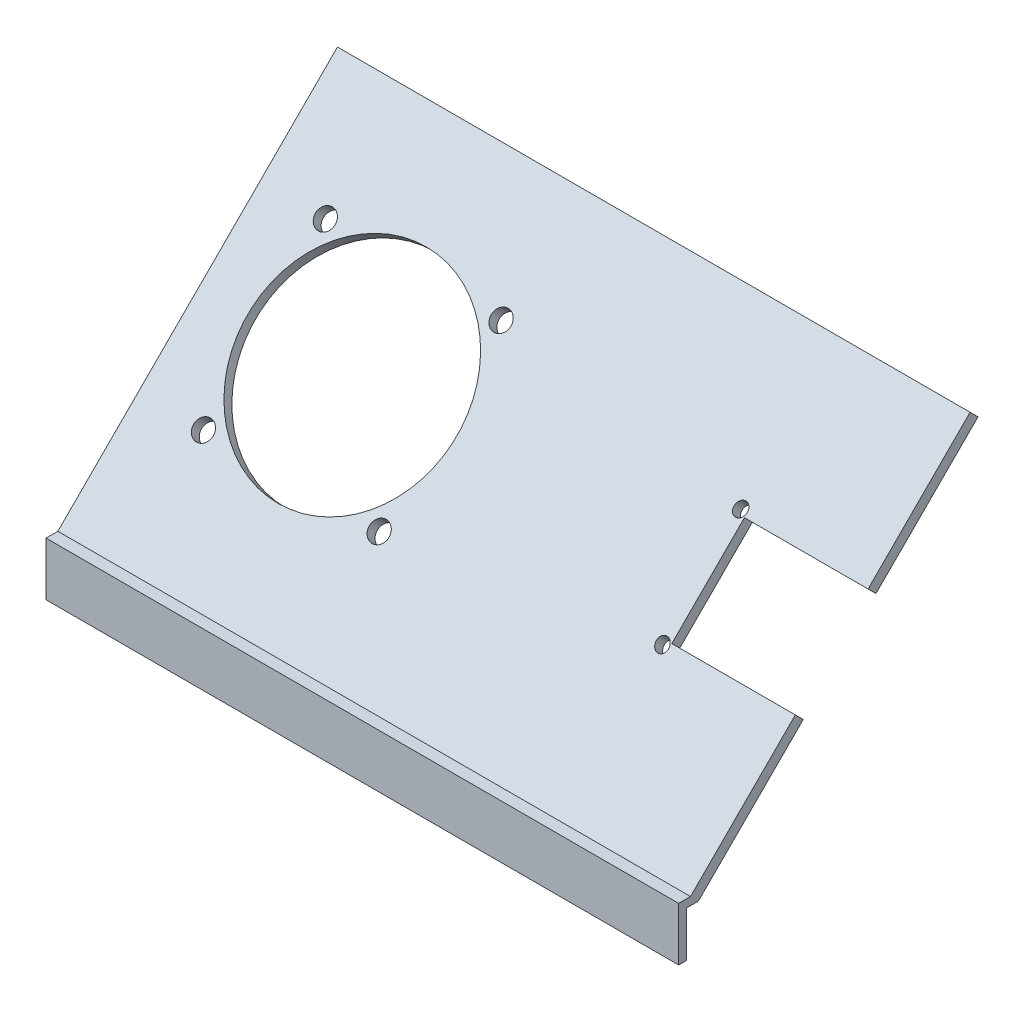
ISO-10303-21;
HEADER;
FILE_DESCRIPTION(('STEP AP214'),'2;1');
FILE_NAME('part.step','',(''),(''),'','','');
FILE_SCHEMA(('AUTOMOTIVE_DESIGN { 1 0 10303 214 1 1 1 1 }'));
ENDSEC;
DATA;
#1=APPLICATION_CONTEXT('core data for automotive mechanical design processes');
#2=APPLICATION_PROTOCOL_DEFINITION('international standard','automotive_design',2000,#1);
#3=PRODUCT_CONTEXT('',#1,'mechanical');
#4=PRODUCT('Part','Part','',(#3));
#5=PRODUCT_RELATED_PRODUCT_CATEGORY('part','',(#4));
#6=PRODUCT_DEFINITION_FORMATION('','',#4);
#7=PRODUCT_DEFINITION_CONTEXT('part definition',#1,'design');
#8=PRODUCT_DEFINITION('design','',#6,#7);
#9=PRODUCT_DEFINITION_SHAPE('','',#8);
#10=(LENGTH_UNIT() NAMED_UNIT(*) SI_UNIT(.MILLI.,.METRE.));
#11=(NAMED_UNIT(*) PLANE_ANGLE_UNIT() SI_UNIT($,.RADIAN.));
#12=(NAMED_UNIT(*) SI_UNIT($,.STERADIAN.) SOLID_ANGLE_UNIT());
#13=UNCERTAINTY_MEASURE_WITH_UNIT(LENGTH_MEASURE(1.E-05),#10,'distance_accuracy_value','');
#14=(GEOMETRIC_REPRESENTATION_CONTEXT(3) GLOBAL_UNCERTAINTY_ASSIGNED_CONTEXT((#13)) GLOBAL_UNIT_ASSIGNED_CONTEXT((#10,
#11,#12)) REPRESENTATION_CONTEXT('',''));
#15=CARTESIAN_POINT('',(0.,0.,0.));
#16=DIRECTION('',(0.,0.,1.));
#17=DIRECTION('',(1.,0.,0.));
#18=AXIS2_PLACEMENT_3D('',#15,#16,#17);
#19=CARTESIAN_POINT('',(160.,0.,0.));
#20=DIRECTION('',(1.,0.,0.));
#21=DIRECTION('',(0.,0.,-1.));
#22=AXIS2_PLACEMENT_3D('',#19,#20,#21);
#23=PLANE('',#22);
#24=DIRECTION('',(0.,-0.707106781186545,-0.70710678118655));
#25=VECTOR('',#24,1.);
#26=CARTESIAN_POINT('',(160.,77.960678118655,-77.9606781186545));
#27=LINE('',#26,#25);
#28=CARTESIAN_POINT('',(160.,84.2106781186548,-71.7106781186547));
#29=VERTEX_POINT('',#28);
#30=CARTESIAN_POINT('',(160.,82.2106781186548,-73.7106781186547));
#31=VERTEX_POINT('',#30);
#32=EDGE_CURVE('E277',#29,#31,#27,.T.);
#33=ORIENTED_EDGE('',*,*,#32,.F.);
#34=DIRECTION('',(0.,0.707106781186548,-0.707106781186548));
#35=VECTOR('',#34,1.);
#36=CARTESIAN_POINT('',(160.,6.25,6.25));
#37=LINE('',#36,#35);
#38=CARTESIAN_POINT('',(160.,58.4012806053458,-45.9012806053458));
#39=VERTEX_POINT('',#38);
#40=EDGE_CURVE('E172',#39,#29,#37,.T.);
#41=ORIENTED_EDGE('',*,*,#40,.F.);
#42=DIRECTION('',(0.,0.707106781186548,0.707106781186547));
#43=VECTOR('',#42,1.);
#44=CARTESIAN_POINT('',(160.,51.3302127934803,-52.9723484172112));
#45=LINE('',#44,#43);
#46=CARTESIAN_POINT('',(160.,56.4012806053458,-47.9012806053457));
#47=VERTEX_POINT('',#46);
#48=EDGE_CURVE('E274',#47,#39,#45,.T.);
#49=ORIENTED_EDGE('',*,*,#48,.F.);
#50=DIRECTION('',(0.,0.707106781186549,-0.707106781186546));
#51=VECTOR('',#50,1.);
#52=CARTESIAN_POINT('',(160.,4.24999999999998,4.25));
#53=LINE('',#52,#51);
#54=EDGE_CURVE('E279',#47,#31,#53,.T.);
#55=ORIENTED_EDGE('',*,*,#54,.T.);
#56=EDGE_LOOP('',(#33,#41,#49,#55));
#57=FACE_BOUND('',#56,.T.);
#58=ADVANCED_FACE('F36',(#57),#23,.T.);
#59=DIRECTION('',(0.,0.,1.));
#60=VECTOR('',#59,1.);
#61=CARTESIAN_POINT('',(160.,13.5,-3.));
#62=LINE('',#61,#60);
#63=CARTESIAN_POINT('',(160.,13.5,-0.999999999999992));
#64=VERTEX_POINT('',#63);
#65=CARTESIAN_POINT('',(160.,13.5,2.));
#66=VERTEX_POINT('',#65);
#67=EDGE_CURVE('E182',#64,#66,#62,.T.);
#68=ORIENTED_EDGE('',*,*,#67,.T.);
#69=DIRECTION('',(0.,-1.,0.));
#70=VECTOR('',#69,1.);
#71=CARTESIAN_POINT('',(160.,13.5,2.));
#72=LINE('',#71,#70);
#73=CARTESIAN_POINT('',(160.,0.,2.));
#74=VERTEX_POINT('',#73);
#75=EDGE_CURVE('E179',#66,#74,#72,.T.);
#76=ORIENTED_EDGE('',*,*,#75,.T.);
#77=DIRECTION('',(0.,0.,-1.));
#78=VECTOR('',#77,1.);
#79=CARTESIAN_POINT('',(160.,0.,0.));
#80=LINE('',#79,#78);
#81=CARTESIAN_POINT('',(160.,0.,0.));
#82=VERTEX_POINT('',#81);
#83=EDGE_CURVE('E282',#74,#82,#80,.T.);
#84=ORIENTED_EDGE('',*,*,#83,.T.);
#85=DIRECTION('',(0.,1.,0.));
#86=VECTOR('',#85,1.);
#87=CARTESIAN_POINT('',(160.,0.,0.));
#88=LINE('',#87,#86);
#89=CARTESIAN_POINT('',(160.,11.5,0.));
#90=VERTEX_POINT('',#89);
#91=EDGE_CURVE('E285',#82,#90,#88,.T.);
#92=ORIENTED_EDGE('',*,*,#91,.T.);
#93=DIRECTION('',(0.,0.,-1.));
#94=VECTOR('',#93,1.);
#95=CARTESIAN_POINT('',(160.,11.5,0.));
#96=LINE('',#95,#94);
#97=CARTESIAN_POINT('',(160.,11.5,-3.));
#98=VERTEX_POINT('',#97);
#99=EDGE_CURVE('E288',#90,#98,#96,.T.);
#100=ORIENTED_EDGE('',*,*,#99,.T.);
#101=CARTESIAN_POINT('',(160.,38.0165042944956,-29.5165042944955));
#102=VERTEX_POINT('',#101);
#103=EDGE_CURVE('E173',#98,#102,#53,.T.);
#104=ORIENTED_EDGE('',*,*,#103,.T.);
#105=DIRECTION('',(0.,0.707106781186548,0.707106781186547));
#106=VECTOR('',#105,1.);
#107=CARTESIAN_POINT('',(160.,32.9454364826301,-34.587572106361));
#108=LINE('',#107,#106);
#109=CARTESIAN_POINT('',(160.,40.0165042944955,-27.5165042944955));
#110=VERTEX_POINT('',#109);
#111=EDGE_CURVE('E157',#102,#110,#108,.T.);
#112=ORIENTED_EDGE('',*,*,#111,.T.);
#113=EDGE_CURVE('E165',#64,#110,#37,.T.);
#114=ORIENTED_EDGE('',*,*,#113,.F.);
#115=EDGE_LOOP('',(#68,#76,#84,#92,#100,#104,#112,#114));
#116=FACE_BOUND('',#115,.T.);
#117=ADVANCED_FACE('F176',(#116),#23,.T.);
#118=CARTESIAN_POINT('',(160.,6.25,6.25));
#119=DIRECTION('',(0.,0.707106781186548,0.707106781186548));
#120=DIRECTION('',(0.,-0.707106781186548,0.707106781186548));
#121=AXIS2_PLACEMENT_3D('',#118,#119,#120);
#122=PLANE('',#121);
#123=CARTESIAN_POINT('',(60.9765015030874,64.623057492428,-52.123057492428));
#124=DIRECTION('',(0.,0.707106781186548,0.707106781186547));
#125=DIRECTION('',(0.,-0.707106781186547,0.707106781186548));
#126=AXIS2_PLACEMENT_3D('',#123,#124,#125);
#127=CIRCLE('',#126,2.5);
#128=CARTESIAN_POINT('',(60.9765015030874,62.8552905394617,-50.3552905394617));
#129=VERTEX_POINT('',#128);
#130=EDGE_CURVE('E11',#129,#129,#127,.F.);
#131=ORIENTED_EDGE('',*,*,#130,.T.);
#132=EDGE_LOOP('',(#131));
#133=FACE_BOUND('',#132,.T.);
#134=CARTESIAN_POINT('',(60.9765015030874,33.7947274074133,-21.2947274074133));
#135=DIRECTION('',(0.,0.707106781186548,0.707106781186547));
#136=DIRECTION('',(0.,-0.707106781186547,0.707106781186548));
#137=AXIS2_PLACEMENT_3D('',#134,#135,#136);
#138=CIRCLE('',#137,2.5);
#139=CARTESIAN_POINT('',(60.9765015030874,32.0269604544469,-19.5269604544469));
#140=VERTEX_POINT('',#139);
#141=EDGE_CURVE('E45',#140,#140,#138,.T.);
#142=ORIENTED_EDGE('',*,*,#141,.F.);
#143=EDGE_LOOP('',(#142));
#144=FACE_BOUND('',#143,.T.);
#145=CARTESIAN_POINT('',(127.193555514503,59.2643272931947,-46.7643272931947));
#146=DIRECTION('',(0.,0.707106781186548,0.707106781186547));
#147=DIRECTION('',(0.,-0.707106781186547,0.707106781186548));
#148=AXIS2_PLACEMENT_3D('',#145,#146,#147);
#149=CIRCLE('',#148,1.49999991751132);
#150=CARTESIAN_POINT('',(127.751653592072,60.2488389204361,-47.7488389204361));
#151=VERTEX_POINT('',#150);
#152=CARTESIAN_POINT('',(127.174287998158,60.3248999015878,-47.8248999015878));
#153=VERTEX_POINT('',#152);
#154=EDGE_CURVE('E258',#151,#153,#149,.T.);
#155=ORIENTED_EDGE('',*,*,#154,.F.);
#156=CARTESIAN_POINT('',(127.09453464431,59.1042505586769,-46.604250558677));
#157=DIRECTION('',(0.,0.707106781186548,0.707106781186547));
#158=DIRECTION('',(0.376143738412848,0.655177795736702,-0.655177795736702));
#159=AXIS2_PLACEMENT_3D('',#156,#157,#158);
#160=ELLIPSE('',#159,1.74698893735955,1.59594606809434);
#161=CARTESIAN_POINT('',(127.274685923613,57.9020454944957,-45.4020454944957));
#162=VERTEX_POINT('',#161);
#163=EDGE_CURVE('E530',#162,#151,#160,.T.);
#164=ORIENTED_EDGE('',*,*,#163,.F.);
#165=CARTESIAN_POINT('',(126.995513774118,58.9441738241592,-46.4441738241592));
#166=DIRECTION('',(0.,0.707106781186548,0.707106781186547));
#167=DIRECTION('',(0.,-0.707106781186547,0.707106781186548));
#168=AXIS2_PLACEMENT_3D('',#165,#166,#167);
#169=CIRCLE('',#168,1.50000000000946);
#170=CARTESIAN_POINT('',(126.437433079218,57.9596572072328,-45.4596572072328));
#171=VERTEX_POINT('',#170);
#172=EDGE_CURVE('E531',#171,#162,#169,.T.);
#173=ORIENTED_EDGE('',*,*,#172,.F.);
#174=EDGE_CURVE('E532',#153,#171,#160,.T.);
#175=ORIENTED_EDGE('',*,*,#174,.F.);
#176=EDGE_LOOP('',(#155,#164,#173,#175));
#177=FACE_BOUND('',#176,.T.);
#178=CARTESIAN_POINT('',(127.09453464431,39.3135343411643,-26.8135343411643));
#179=DIRECTION('',(0.,-0.707106781186548,-0.707106781186547));
#180=DIRECTION('',(0.376143738412848,-0.655177795736702,0.655177795736702));
#181=AXIS2_PLACEMENT_3D('',#178,#179,#180);
#182=ELLIPSE('',#181,1.74698893735955,1.59594606809433);
#183=CARTESIAN_POINT('',(127.751653594175,38.1689459800087,-25.6689459800087));
#184=VERTEX_POINT('',#183);
#185=EDGE_CURVE('E231',#184,#184,#182,.T.);
#186=ORIENTED_EDGE('',*,*,#185,.T.);
#187=EDGE_LOOP('',(#186));
#188=FACE_BOUND('',#187,.T.);
#189=CARTESIAN_POINT('',(38.75,49.2088924499207,-36.7088924499206));
#190=DIRECTION('',(0.,0.707106781186548,0.707106781186547));
#191=DIRECTION('',(0.,-0.707106781186547,0.707106781186548));
#192=AXIS2_PLACEMENT_3D('',#189,#190,#191);
#193=CIRCLE('',#192,26.5);
#194=CARTESIAN_POINT('',(38.75,30.4705627484772,-17.9705627484771));
#195=VERTEX_POINT('',#194);
#196=EDGE_CURVE('E260',#195,#195,#193,.T.);
#197=ORIENTED_EDGE('',*,*,#196,.F.);
#198=EDGE_LOOP('',(#197));
#199=FACE_BOUND('',#198,.T.);
#200=CARTESIAN_POINT('',(16.5234984969126,64.623057492428,-52.123057492428));
#201=DIRECTION('',(0.,0.707106781186548,0.707106781186547));
#202=DIRECTION('',(0.,-0.707106781186547,0.707106781186548));
#203=AXIS2_PLACEMENT_3D('',#200,#201,#202);
#204=CIRCLE('',#203,2.5);
#205=CARTESIAN_POINT('',(16.5234984969126,62.8552905394617,-50.3552905394617));
#206=VERTEX_POINT('',#205);
#207=EDGE_CURVE('E265',#206,#206,#204,.T.);
#208=ORIENTED_EDGE('',*,*,#207,.F.);
#209=EDGE_LOOP('',(#208));
#210=FACE_BOUND('',#209,.T.);
#211=CARTESIAN_POINT('',(16.5234984969126,33.7947274074133,-21.2947274074133));
#212=DIRECTION('',(0.,0.707106781186548,0.707106781186547));
#213=DIRECTION('',(0.,-0.707106781186547,0.707106781186548));
#214=AXIS2_PLACEMENT_3D('',#211,#212,#213);
#215=CIRCLE('',#214,2.5);
#216=CARTESIAN_POINT('',(16.5234984969126,32.0269604544469,-19.5269604544469));
#217=VERTEX_POINT('',#216);
#218=EDGE_CURVE('E267',#217,#217,#215,.F.);
#219=ORIENTED_EDGE('',*,*,#218,.T.);
#220=EDGE_LOOP('',(#219));
#221=FACE_BOUND('',#220,.T.);
#222=DIRECTION('',(-1.,0.,0.));
#223=VECTOR('',#222,1.);
#224=CARTESIAN_POINT('',(160.,13.5,-0.999999999999992));
#225=LINE('',#224,#223);
#226=CARTESIAN_POINT('',(0.,13.5,-0.999999999999992));
#227=VERTEX_POINT('',#226);
#228=EDGE_CURVE('E168',#64,#227,#225,.T.);
#229=ORIENTED_EDGE('',*,*,#228,.F.);
#230=ORIENTED_EDGE('',*,*,#113,.T.);
#231=DIRECTION('',(1.,0.,0.));
#232=VECTOR('',#231,1.);
#233=CARTESIAN_POINT('',(0.,40.0165042944955,-27.5165042944955));
#234=LINE('',#233,#232);
#235=CARTESIAN_POINT('',(128.75,40.0165042944955,-27.5165042944955));
#236=VERTEX_POINT('',#235);
#237=EDGE_CURVE('E152',#236,#110,#234,.T.);
#238=ORIENTED_EDGE('',*,*,#237,.F.);
#239=DIRECTION('',(0.,0.707106781186547,-0.707106781186548));
#240=VECTOR('',#239,1.);
#241=CARTESIAN_POINT('',(128.75,6.25000000000001,6.25000000000001));
#242=LINE('',#241,#240);
#243=CARTESIAN_POINT('',(128.75,58.4012806053458,-45.9012806053457));
#244=VERTEX_POINT('',#243);
#245=EDGE_CURVE('E162',#236,#244,#242,.T.);
#246=ORIENTED_EDGE('',*,*,#245,.T.);
#247=DIRECTION('',(1.,0.,0.));
#248=VECTOR('',#247,1.);
#249=CARTESIAN_POINT('',(0.,58.4012806053458,-45.9012806053458));
#250=LINE('',#249,#248);
#251=EDGE_CURVE('E40',#244,#39,#250,.T.);
#252=ORIENTED_EDGE('',*,*,#251,.T.);
#253=ORIENTED_EDGE('',*,*,#40,.T.);
#254=DIRECTION('',(-1.,0.,0.));
#255=VECTOR('',#254,1.);
#256=CARTESIAN_POINT('',(160.,84.2106781186548,-71.7106781186547));
#257=LINE('',#256,#255);
#258=CARTESIAN_POINT('',(0.,84.2106781186548,-71.7106781186547));
#259=VERTEX_POINT('',#258);
#260=EDGE_CURVE('E204',#29,#259,#257,.T.);
#261=ORIENTED_EDGE('',*,*,#260,.T.);
#262=DIRECTION('',(0.,0.707106781186548,-0.707106781186548));
#263=VECTOR('',#262,1.);
#264=CARTESIAN_POINT('',(0.,6.25,6.25));
#265=LINE('',#264,#263);
#266=EDGE_CURVE('E214',#227,#259,#265,.T.);
#267=ORIENTED_EDGE('',*,*,#266,.F.);
#268=EDGE_LOOP('',(#229,#230,#238,#246,#252,#253,#261,#267));
#269=FACE_BOUND('',#268,.T.);
#270=ADVANCED_FACE('F166',(#133,#144,#177,#188,#199,#210,#221,#269),#122,.T.);
#271=CARTESIAN_POINT('',(160.,4.24999999999998,4.25));
#272=DIRECTION('',(0.,0.707106781186546,0.707106781186549));
#273=DIRECTION('',(0.,-0.707106781186549,0.707106781186546));
#274=AXIS2_PLACEMENT_3D('',#271,#272,#273);
#275=PLANE('',#274);
#276=CARTESIAN_POINT('',(60.9765015030874,62.6230574924281,-54.1230574924279));
#277=DIRECTION('',(0.,0.707106781186546,0.707106781186549));
#278=DIRECTION('',(0.,-0.707106781186549,0.707106781186546));
#279=AXIS2_PLACEMENT_3D('',#276,#277,#278);
#280=CIRCLE('',#279,2.5);
#281=CARTESIAN_POINT('',(60.9765015030874,60.8552905394617,-52.3552905394616));
#282=VERTEX_POINT('',#281);
#283=EDGE_CURVE('E263',#282,#282,#280,.F.);
#284=ORIENTED_EDGE('',*,*,#283,.F.);
#285=EDGE_LOOP('',(#284));
#286=FACE_BOUND('',#285,.T.);
#287=CARTESIAN_POINT('',(16.5234984969126,31.7947274074133,-23.2947274074132));
#288=DIRECTION('',(0.,0.707106781186546,0.707106781186549));
#289=DIRECTION('',(0.,-0.707106781186549,0.707106781186546));
#290=AXIS2_PLACEMENT_3D('',#287,#288,#289);
#291=CIRCLE('',#290,2.5);
#292=CARTESIAN_POINT('',(16.5234984969126,30.0269604544469,-21.5269604544469));
#293=VERTEX_POINT('',#292);
#294=EDGE_CURVE('E505',#293,#293,#291,.F.);
#295=ORIENTED_EDGE('',*,*,#294,.F.);
#296=EDGE_LOOP('',(#295));
#297=FACE_BOUND('',#296,.T.);
#298=CARTESIAN_POINT('',(127.09453464431,57.1042505586769,-48.604250558677));
#299=DIRECTION('',(0.,0.707106781186548,0.707106781186547));
#300=DIRECTION('',(0.376143738412848,0.655177795736702,-0.655177795736702));
#301=AXIS2_PLACEMENT_3D('',#298,#299,#300);
#302=ELLIPSE('',#301,1.74698893735955,1.59594606809434);
#303=CARTESIAN_POINT('',(127.274685923613,55.9020454944958,-47.4020454944956));
#304=VERTEX_POINT('',#303);
#305=CARTESIAN_POINT('',(127.751653592072,58.2488389204361,-49.7488389204361));
#306=VERTEX_POINT('',#305);
#307=EDGE_CURVE('E516',#304,#306,#302,.T.);
#308=ORIENTED_EDGE('',*,*,#307,.T.);
#309=CARTESIAN_POINT('',(127.193555514503,57.2643272931948,-48.7643272931946));
#310=DIRECTION('',(0.,0.707106781186546,0.707106781186549));
#311=DIRECTION('',(0.,-0.707106781186549,0.707106781186546));
#312=AXIS2_PLACEMENT_3D('',#309,#310,#311);
#313=CIRCLE('',#312,1.49999991751132);
#314=CARTESIAN_POINT('',(127.174287998158,58.3248999015878,-49.8248999015879));
#315=VERTEX_POINT('',#314);
#316=EDGE_CURVE('E276',#306,#315,#313,.T.);
#317=ORIENTED_EDGE('',*,*,#316,.T.);
#318=CARTESIAN_POINT('',(127.09453464431,57.1042505586769,-48.604250558677));
#319=DIRECTION('',(0.,0.707106781186548,0.707106781186547));
#320=DIRECTION('',(0.376143738412848,0.655177795736702,-0.655177795736702));
#321=AXIS2_PLACEMENT_3D('',#318,#319,#320);
#322=ELLIPSE('',#321,1.74698893735955,1.59594606809434);
#323=CARTESIAN_POINT('',(126.437433079218,55.9596572072327,-47.4596572072328));
#324=VERTEX_POINT('',#323);
#325=EDGE_CURVE('E190',#315,#324,#322,.T.);
#326=ORIENTED_EDGE('',*,*,#325,.T.);
#327=CARTESIAN_POINT('',(126.995513774118,56.9441738241593,-48.4441738241592));
#328=DIRECTION('',(0.,0.707106781186546,0.707106781186549));
#329=DIRECTION('',(0.,-0.707106781186549,0.707106781186546));
#330=AXIS2_PLACEMENT_3D('',#327,#328,#329);
#331=CIRCLE('',#330,1.50000000000946);
#332=EDGE_CURVE('E519',#324,#304,#331,.T.);
#333=ORIENTED_EDGE('',*,*,#332,.T.);
#334=EDGE_LOOP('',(#308,#317,#326,#333));
#335=FACE_BOUND('',#334,.T.);
#336=CARTESIAN_POINT('',(127.09453464431,37.3135343411643,-28.8135343411643));
#337=DIRECTION('',(0.,-0.707106781186548,-0.707106781186547));
#338=DIRECTION('',(0.376143738412848,-0.655177795736702,0.655177795736702));
#339=AXIS2_PLACEMENT_3D('',#336,#337,#338);
#340=ELLIPSE('',#339,1.74698893735955,1.59594606809433);
#341=CARTESIAN_POINT('',(127.751653594175,36.1689459800087,-27.6689459800087));
#342=VERTEX_POINT('',#341);
#343=EDGE_CURVE('E321',#342,#342,#340,.T.);
#344=ORIENTED_EDGE('',*,*,#343,.F.);
#345=EDGE_LOOP('',(#344));
#346=FACE_BOUND('',#345,.T.);
#347=CARTESIAN_POINT('',(38.75,47.2088924499207,-38.7088924499206));
#348=DIRECTION('',(0.,0.707106781186546,0.707106781186549));
#349=DIRECTION('',(0.,-0.707106781186549,0.707106781186546));
#350=AXIS2_PLACEMENT_3D('',#347,#348,#349);
#351=CIRCLE('',#350,26.5);
#352=CARTESIAN_POINT('',(38.75,28.4705627484772,-19.9705627484771));
#353=VERTEX_POINT('',#352);
#354=EDGE_CURVE('E264',#353,#353,#351,.T.);
#355=ORIENTED_EDGE('',*,*,#354,.T.);
#356=EDGE_LOOP('',(#355));
#357=FACE_BOUND('',#356,.T.);
#358=CARTESIAN_POINT('',(16.5234984969126,62.6230574924281,-54.1230574924279));
#359=DIRECTION('',(0.,0.707106781186546,0.707106781186549));
#360=DIRECTION('',(0.,-0.707106781186549,0.707106781186546));
#361=AXIS2_PLACEMENT_3D('',#358,#359,#360);
#362=CIRCLE('',#361,2.5);
#363=CARTESIAN_POINT('',(16.5234984969126,60.8552905394618,-52.3552905394616));
#364=VERTEX_POINT('',#363);
#365=EDGE_CURVE('E268',#364,#364,#362,.T.);
#366=ORIENTED_EDGE('',*,*,#365,.T.);
#367=EDGE_LOOP('',(#366));
#368=FACE_BOUND('',#367,.T.);
#369=CARTESIAN_POINT('',(60.9765015030874,31.7947274074133,-23.2947274074132));
#370=DIRECTION('',(0.,0.707106781186546,0.707106781186549));
#371=DIRECTION('',(0.,-0.707106781186549,0.707106781186546));
#372=AXIS2_PLACEMENT_3D('',#369,#370,#371);
#373=CIRCLE('',#372,2.5);
#374=CARTESIAN_POINT('',(60.9765015030874,30.0269604544469,-21.5269604544469));
#375=VERTEX_POINT('',#374);
#376=EDGE_CURVE('E502',#375,#375,#373,.T.);
#377=ORIENTED_EDGE('',*,*,#376,.T.);
#378=EDGE_LOOP('',(#377));
#379=FACE_BOUND('',#378,.T.);
#380=ORIENTED_EDGE('',*,*,#103,.F.);
#381=DIRECTION('',(-1.,0.,0.));
#382=VECTOR('',#381,1.);
#383=CARTESIAN_POINT('',(160.,11.5,-3.));
#384=LINE('',#383,#382);
#385=CARTESIAN_POINT('',(0.,11.5,-3.));
#386=VERTEX_POINT('',#385);
#387=EDGE_CURVE('E197',#98,#386,#384,.T.);
#388=ORIENTED_EDGE('',*,*,#387,.T.);
#389=DIRECTION('',(0.,0.707106781186549,-0.707106781186546));
#390=VECTOR('',#389,1.);
#391=CARTESIAN_POINT('',(0.,4.24999999999998,4.25));
#392=LINE('',#391,#390);
#393=CARTESIAN_POINT('',(0.,82.2106781186548,-73.7106781186547));
#394=VERTEX_POINT('',#393);
#395=EDGE_CURVE('E209',#386,#394,#392,.T.);
#396=ORIENTED_EDGE('',*,*,#395,.T.);
#397=DIRECTION('',(-1.,0.,0.));
#398=VECTOR('',#397,1.);
#399=CARTESIAN_POINT('',(160.,82.2106781186548,-73.7106781186547));
#400=LINE('',#399,#398);
#401=EDGE_CURVE('E208',#31,#394,#400,.T.);
#402=ORIENTED_EDGE('',*,*,#401,.F.);
#403=ORIENTED_EDGE('',*,*,#54,.F.);
#404=DIRECTION('',(1.,0.,0.));
#405=VECTOR('',#404,1.);
#406=CARTESIAN_POINT('',(160.,56.4012806053458,-47.9012806053457));
#407=LINE('',#406,#405);
#408=CARTESIAN_POINT('',(128.75,56.4012806053458,-47.9012806053457));
#409=VERTEX_POINT('',#408);
#410=EDGE_CURVE('E186',#409,#47,#407,.T.);
#411=ORIENTED_EDGE('',*,*,#410,.F.);
#412=DIRECTION('',(0.,0.707106781186549,-0.707106781186546));
#413=VECTOR('',#412,1.);
#414=CARTESIAN_POINT('',(128.75,4.24999999999998,4.25));
#415=LINE('',#414,#413);
#416=CARTESIAN_POINT('',(128.75,38.0165042944956,-29.5165042944955));
#417=VERTEX_POINT('',#416);
#418=EDGE_CURVE('E192',#417,#409,#415,.T.);
#419=ORIENTED_EDGE('',*,*,#418,.F.);
#420=DIRECTION('',(1.,0.,0.));
#421=VECTOR('',#420,1.);
#422=CARTESIAN_POINT('',(160.,38.0165042944956,-29.5165042944955));
#423=LINE('',#422,#421);
#424=EDGE_CURVE('E189',#417,#102,#423,.T.);
#425=ORIENTED_EDGE('',*,*,#424,.T.);
#426=EDGE_LOOP('',(#380,#388,#396,#402,#403,#411,#419,#425));
#427=FACE_BOUND('',#426,.T.);
#428=ADVANCED_FACE('F312',(#286,#297,#335,#346,#357,#368,#379,#427),#275,.F.);
#429=CARTESIAN_POINT('',(160.,0.,0.));
#430=DIRECTION('',(0.,1.,0.));
#431=DIRECTION('',(0.,0.,1.));
#432=AXIS2_PLACEMENT_3D('',#429,#430,#431);
#433=PLANE('',#432);
#434=ORIENTED_EDGE('',*,*,#83,.F.);
#435=DIRECTION('',(-1.,0.,0.));
#436=VECTOR('',#435,1.);
#437=CARTESIAN_POINT('',(160.,0.,2.));
#438=LINE('',#437,#436);
#439=CARTESIAN_POINT('',(0.,0.,2.));
#440=VERTEX_POINT('',#439);
#441=EDGE_CURVE('E201',#74,#440,#438,.T.);
#442=ORIENTED_EDGE('',*,*,#441,.T.);
#443=DIRECTION('',(0.,0.,-1.));
#444=VECTOR('',#443,1.);
#445=CARTESIAN_POINT('',(0.,0.,0.));
#446=LINE('',#445,#444);
#447=CARTESIAN_POINT('',(0.,0.,0.));
#448=VERTEX_POINT('',#447);
#449=EDGE_CURVE('E206',#440,#448,#446,.T.);
#450=ORIENTED_EDGE('',*,*,#449,.T.);
#451=DIRECTION('',(-1.,0.,0.));
#452=VECTOR('',#451,1.);
#453=CARTESIAN_POINT('',(160.,0.,0.));
#454=LINE('',#453,#452);
#455=EDGE_CURVE('E193',#82,#448,#454,.T.);
#456=ORIENTED_EDGE('',*,*,#455,.F.);
#457=EDGE_LOOP('',(#434,#442,#450,#456));
#458=FACE_BOUND('',#457,.T.);
#459=ADVANCED_FACE('F300',(#458),#433,.F.);
#460=CARTESIAN_POINT('',(160.,0.,0.));
#461=DIRECTION('',(0.,0.,1.));
#462=DIRECTION('',(1.,0.,0.));
#463=AXIS2_PLACEMENT_3D('',#460,#461,#462);
#464=PLANE('',#463);
#465=ORIENTED_EDGE('',*,*,#91,.F.);
#466=ORIENTED_EDGE('',*,*,#455,.T.);
#467=DIRECTION('',(0.,1.,0.));
#468=VECTOR('',#467,1.);
#469=CARTESIAN_POINT('',(0.,0.,0.));
#470=LINE('',#469,#468);
#471=CARTESIAN_POINT('',(0.,11.5,0.));
#472=VERTEX_POINT('',#471);
#473=EDGE_CURVE('E307',#448,#472,#470,.T.);
#474=ORIENTED_EDGE('',*,*,#473,.T.);
#475=DIRECTION('',(-1.,0.,0.));
#476=VECTOR('',#475,1.);
#477=CARTESIAN_POINT('',(160.,11.5,0.));
#478=LINE('',#477,#476);
#479=EDGE_CURVE('E195',#90,#472,#478,.T.);
#480=ORIENTED_EDGE('',*,*,#479,.F.);
#481=EDGE_LOOP('',(#465,#466,#474,#480));
#482=FACE_BOUND('',#481,.T.);
#483=ADVANCED_FACE('F304',(#482),#464,.F.);
#484=CARTESIAN_POINT('',(160.,11.5,0.));
#485=DIRECTION('',(0.,1.,0.));
#486=DIRECTION('',(0.,0.,1.));
#487=AXIS2_PLACEMENT_3D('',#484,#485,#486);
#488=PLANE('',#487);
#489=ORIENTED_EDGE('',*,*,#99,.F.);
#490=ORIENTED_EDGE('',*,*,#479,.T.);
#491=DIRECTION('',(0.,0.,-1.));
#492=VECTOR('',#491,1.);
#493=CARTESIAN_POINT('',(0.,11.5,0.));
#494=LINE('',#493,#492);
#495=EDGE_CURVE('E311',#472,#386,#494,.T.);
#496=ORIENTED_EDGE('',*,*,#495,.T.);
#497=ORIENTED_EDGE('',*,*,#387,.F.);
#498=EDGE_LOOP('',(#489,#490,#496,#497));
#499=FACE_BOUND('',#498,.T.);
#500=ADVANCED_FACE('F38',(#499),#488,.F.);
#501=CARTESIAN_POINT('',(160.,13.5,-3.));
#502=DIRECTION('',(0.,-1.,0.));
#503=DIRECTION('',(0.,0.,-1.));
#504=AXIS2_PLACEMENT_3D('',#501,#502,#503);
#505=PLANE('',#504);
#506=ORIENTED_EDGE('',*,*,#67,.F.);
#507=ORIENTED_EDGE('',*,*,#228,.T.);
#508=DIRECTION('',(0.,0.,1.));
#509=VECTOR('',#508,1.);
#510=CARTESIAN_POINT('',(0.,13.5,-3.));
#511=LINE('',#510,#509);
#512=CARTESIAN_POINT('',(0.,13.5,2.));
#513=VERTEX_POINT('',#512);
#514=EDGE_CURVE('E324',#227,#513,#511,.T.);
#515=ORIENTED_EDGE('',*,*,#514,.T.);
#516=DIRECTION('',(-1.,0.,0.));
#517=VECTOR('',#516,1.);
#518=CARTESIAN_POINT('',(160.,13.5,2.));
#519=LINE('',#518,#517);
#520=EDGE_CURVE('E199',#66,#513,#519,.T.);
#521=ORIENTED_EDGE('',*,*,#520,.F.);
#522=EDGE_LOOP('',(#506,#507,#515,#521));
#523=FACE_BOUND('',#522,.T.);
#524=ADVANCED_FACE('F365',(#523),#505,.F.);
#525=CARTESIAN_POINT('',(160.,13.5,2.));
#526=DIRECTION('',(0.,0.,-1.));
#527=DIRECTION('',(-1.,0.,0.));
#528=AXIS2_PLACEMENT_3D('',#525,#526,#527);
#529=PLANE('',#528);
#530=ORIENTED_EDGE('',*,*,#75,.F.);
#531=ORIENTED_EDGE('',*,*,#520,.T.);
#532=DIRECTION('',(0.,-1.,0.));
#533=VECTOR('',#532,1.);
#534=CARTESIAN_POINT('',(0.,13.5,2.));
#535=LINE('',#534,#533);
#536=EDGE_CURVE('E203',#513,#440,#535,.T.);
#537=ORIENTED_EDGE('',*,*,#536,.T.);
#538=ORIENTED_EDGE('',*,*,#441,.F.);
#539=EDGE_LOOP('',(#530,#531,#537,#538));
#540=FACE_BOUND('',#539,.T.);
#541=ADVANCED_FACE('F292',(#540),#529,.F.);
#542=CARTESIAN_POINT('',(160.,77.960678118655,-77.9606781186545));
#543=DIRECTION('',(0.,0.70710678118655,-0.707106781186545));
#544=DIRECTION('',(0.,0.707106781186545,0.70710678118655));
#545=AXIS2_PLACEMENT_3D('',#542,#543,#544);
#546=PLANE('',#545);
#547=ORIENTED_EDGE('',*,*,#260,.F.);
#548=ORIENTED_EDGE('',*,*,#32,.T.);
#549=ORIENTED_EDGE('',*,*,#401,.T.);
#550=DIRECTION('',(0.,-0.707106781186545,-0.70710678118655));
#551=VECTOR('',#550,1.);
#552=CARTESIAN_POINT('',(0.,77.960678118655,-77.9606781186545));
#553=LINE('',#552,#551);
#554=EDGE_CURVE('E220',#259,#394,#553,.T.);
#555=ORIENTED_EDGE('',*,*,#554,.F.);
#556=EDGE_LOOP('',(#547,#548,#549,#555));
#557=FACE_BOUND('',#556,.T.);
#558=ADVANCED_FACE('F330',(#557),#546,.T.);
#559=CARTESIAN_POINT('',(0.,51.3302127934803,-52.9723484172112));
#560=DIRECTION('',(0.,-0.707106781186547,0.707106781186548));
#561=DIRECTION('',(0.,-0.707106781186548,-0.707106781186547));
#562=AXIS2_PLACEMENT_3D('',#559,#560,#561);
#563=PLANE('',#562);
#564=ORIENTED_EDGE('',*,*,#410,.T.);
#565=ORIENTED_EDGE('',*,*,#48,.T.);
#566=ORIENTED_EDGE('',*,*,#251,.F.);
#567=DIRECTION('',(0.,0.707106781186548,0.707106781186547));
#568=VECTOR('',#567,1.);
#569=CARTESIAN_POINT('',(128.75,51.3302127934803,-52.9723484172112));
#570=LINE('',#569,#568);
#571=EDGE_CURVE('E163',#409,#244,#570,.T.);
#572=ORIENTED_EDGE('',*,*,#571,.F.);
#573=EDGE_LOOP('',(#564,#565,#566,#572));
#574=FACE_BOUND('',#573,.T.);
#575=ADVANCED_FACE('F337',(#574),#563,.T.);
#576=CARTESIAN_POINT('',(0.,32.9454364826301,-34.587572106361));
#577=DIRECTION('',(0.,-0.707106781186547,0.707106781186548));
#578=DIRECTION('',(0.,-0.707106781186548,-0.707106781186547));
#579=AXIS2_PLACEMENT_3D('',#576,#577,#578);
#580=PLANE('',#579);
#581=ORIENTED_EDGE('',*,*,#111,.F.);
#582=ORIENTED_EDGE('',*,*,#424,.F.);
#583=DIRECTION('',(0.,0.707106781186548,0.707106781186547));
#584=VECTOR('',#583,1.);
#585=CARTESIAN_POINT('',(128.75,32.9454364826301,-34.587572106361));
#586=LINE('',#585,#584);
#587=EDGE_CURVE('E158',#417,#236,#586,.T.);
#588=ORIENTED_EDGE('',*,*,#587,.T.);
#589=ORIENTED_EDGE('',*,*,#237,.T.);
#590=EDGE_LOOP('',(#581,#582,#588,#589));
#591=FACE_BOUND('',#590,.T.);
#592=ADVANCED_FACE('F154',(#591),#580,.F.);
#593=CARTESIAN_POINT('',(0.,0.,0.));
#594=DIRECTION('',(1.,0.,0.));
#595=DIRECTION('',(0.,0.,-1.));
#596=AXIS2_PLACEMENT_3D('',#593,#594,#595);
#597=PLANE('',#596);
#598=ORIENTED_EDGE('',*,*,#514,.F.);
#599=ORIENTED_EDGE('',*,*,#266,.T.);
#600=ORIENTED_EDGE('',*,*,#554,.T.);
#601=ORIENTED_EDGE('',*,*,#395,.F.);
#602=ORIENTED_EDGE('',*,*,#495,.F.);
#603=ORIENTED_EDGE('',*,*,#473,.F.);
#604=ORIENTED_EDGE('',*,*,#449,.F.);
#605=ORIENTED_EDGE('',*,*,#536,.F.);
#606=EDGE_LOOP('',(#598,#599,#600,#601,#602,#603,#604,#605));
#607=FACE_BOUND('',#606,.T.);
#608=ADVANCED_FACE('F328',(#607),#597,.F.);
#609=CARTESIAN_POINT('',(128.75,-0.821067811865463,-0.821067811865464));
#610=DIRECTION('',(1.,0.,0.));
#611=DIRECTION('',(0.,0.,-1.));
#612=AXIS2_PLACEMENT_3D('',#609,#610,#611);
#613=PLANE('',#612);
#614=ORIENTED_EDGE('',*,*,#418,.T.);
#615=ORIENTED_EDGE('',*,*,#571,.T.);
#616=ORIENTED_EDGE('',*,*,#245,.F.);
#617=ORIENTED_EDGE('',*,*,#587,.F.);
#618=EDGE_LOOP('',(#614,#615,#616,#617));
#619=FACE_BOUND('',#618,.T.);
#620=ADVANCED_FACE('F239',(#619),#613,.T.);
#621=CARTESIAN_POINT('',(127.09453464431,32.2424665292989,-33.8846021530298));
#622=DIRECTION('',(0.,-0.707106781186548,-0.707106781186547));
#623=DIRECTION('',(0.376143738412848,-0.655177795736702,0.655177795736702));
#624=AXIS2_PLACEMENT_3D('',#621,#622,#623);
#625=ELLIPSE('',#624,1.74698893735955,1.59594606809433);
#626=DIRECTION('',(0.,0.707106781186548,0.707106781186547));
#627=VECTOR('',#626,1.);
#628=SURFACE_OF_LINEAR_EXTRUSION('',#625,#627);
#629=ORIENTED_EDGE('',*,*,#185,.F.);
#630=EDGE_LOOP('',(#629));
#631=FACE_BOUND('',#630,.T.);
#632=ORIENTED_EDGE('',*,*,#343,.T.);
#633=EDGE_LOOP('',(#632));
#634=FACE_BOUND('',#633,.T.);
#635=ADVANCED_FACE('F234',(#631,#634),#628,.T.);
#636=CARTESIAN_POINT('',(127.193555514503,52.1932594813292,-53.8353951050602));
#637=DIRECTION('',(0.,0.707106781186548,0.707106781186547));
#638=DIRECTION('',(0.,-0.707106781186547,0.707106781186548));
#639=AXIS2_PLACEMENT_3D('',#636,#637,#638);
#640=CYLINDRICAL_SURFACE('',#639,1.49999991751132);
#641=DIRECTION('',(0.,0.707106781186548,0.707106781186547));
#642=VECTOR('',#641,1.);
#643=CARTESIAN_POINT('',(127.751653592072,53.1777711085706,-54.8199067323015));
#644=LINE('',#643,#642);
#645=EDGE_CURVE('E536',#306,#151,#644,.T.);
#646=ORIENTED_EDGE('',*,*,#645,.T.);
#647=ORIENTED_EDGE('',*,*,#154,.T.);
#648=DIRECTION('',(0.,0.707106781186548,0.707106781186547));
#649=VECTOR('',#648,1.);
#650=CARTESIAN_POINT('',(127.174287998158,53.2538320897224,-54.8959677134533));
#651=LINE('',#650,#649);
#652=EDGE_CURVE('E526',#315,#153,#651,.T.);
#653=ORIENTED_EDGE('',*,*,#652,.F.);
#654=ORIENTED_EDGE('',*,*,#316,.F.);
#655=EDGE_LOOP('',(#646,#647,#653,#654));
#656=FACE_BOUND('',#655,.T.);
#657=ADVANCED_FACE('F238',(#656),#640,.F.);
#658=CARTESIAN_POINT('',(127.09453464431,52.0331827468114,-53.6753183705425));
#659=DIRECTION('',(0.,0.707106781186548,0.707106781186547));
#660=DIRECTION('',(0.376143738412848,0.655177795736702,-0.655177795736702));
#661=AXIS2_PLACEMENT_3D('',#658,#659,#660);
#662=ELLIPSE('',#661,1.74698893735955,1.59594606809434);
#663=DIRECTION('',(0.,0.707106781186548,0.707106781186547));
#664=VECTOR('',#663,1.);
#665=SURFACE_OF_LINEAR_EXTRUSION('',#662,#664);
#666=DIRECTION('',(0.,0.707106781186548,0.707106781186547));
#667=VECTOR('',#666,1.);
#668=CARTESIAN_POINT('',(127.274685923613,50.8309776826302,-52.4731133063612));
#669=LINE('',#668,#667);
#670=EDGE_CURVE('E61',#304,#162,#669,.T.);
#671=ORIENTED_EDGE('',*,*,#670,.T.);
#672=ORIENTED_EDGE('',*,*,#163,.T.);
#673=ORIENTED_EDGE('',*,*,#645,.F.);
#674=ORIENTED_EDGE('',*,*,#307,.F.);
#675=EDGE_LOOP('',(#671,#672,#673,#674));
#676=FACE_BOUND('',#675,.T.);
#677=ADVANCED_FACE('F244',(#676),#665,.F.);
#678=CARTESIAN_POINT('',(126.995513774118,51.8731060122937,-53.5152416360247));
#679=DIRECTION('',(0.,0.707106781186548,0.707106781186547));
#680=DIRECTION('',(0.,-0.707106781186547,0.707106781186548));
#681=AXIS2_PLACEMENT_3D('',#678,#679,#680);
#682=CYLINDRICAL_SURFACE('',#681,1.50000000000946);
#683=DIRECTION('',(0.,0.707106781186548,0.707106781186547));
#684=VECTOR('',#683,1.);
#685=CARTESIAN_POINT('',(126.437433079218,50.8885893953673,-52.5307250190982));
#686=LINE('',#685,#684);
#687=EDGE_CURVE('E53',#324,#171,#686,.T.);
#688=ORIENTED_EDGE('',*,*,#687,.T.);
#689=ORIENTED_EDGE('',*,*,#172,.T.);
#690=ORIENTED_EDGE('',*,*,#670,.F.);
#691=ORIENTED_EDGE('',*,*,#332,.F.);
#692=EDGE_LOOP('',(#688,#689,#690,#691));
#693=FACE_BOUND('',#692,.T.);
#694=ADVANCED_FACE('F246',(#693),#682,.F.);
#695=ORIENTED_EDGE('',*,*,#652,.T.);
#696=ORIENTED_EDGE('',*,*,#174,.T.);
#697=ORIENTED_EDGE('',*,*,#687,.F.);
#698=ORIENTED_EDGE('',*,*,#325,.F.);
#699=EDGE_LOOP('',(#695,#696,#697,#698));
#700=FACE_BOUND('',#699,.T.);
#701=ADVANCED_FACE('F249',(#700),#665,.F.);
#702=CARTESIAN_POINT('',(38.75,42.1378246380552,-43.7799602617861));
#703=DIRECTION('',(0.,0.707106781186548,0.707106781186547));
#704=DIRECTION('',(0.,-0.707106781186547,0.707106781186548));
#705=AXIS2_PLACEMENT_3D('',#702,#703,#704);
#706=CYLINDRICAL_SURFACE('',#705,26.5);
#707=ORIENTED_EDGE('',*,*,#196,.T.);
#708=EDGE_LOOP('',(#707));
#709=FACE_BOUND('',#708,.T.);
#710=ORIENTED_EDGE('',*,*,#354,.F.);
#711=EDGE_LOOP('',(#710));
#712=FACE_BOUND('',#711,.T.);
#713=ADVANCED_FACE('F253',(#709,#712),#706,.F.);
#714=CARTESIAN_POINT('',(16.5234984969126,57.5519896805625,-59.1941253042935));
#715=DIRECTION('',(0.,0.707106781186548,0.707106781186547));
#716=DIRECTION('',(0.,-0.707106781186547,0.707106781186548));
#717=AXIS2_PLACEMENT_3D('',#714,#715,#716);
#718=CYLINDRICAL_SURFACE('',#717,2.5);
#719=ORIENTED_EDGE('',*,*,#207,.T.);
#720=EDGE_LOOP('',(#719));
#721=FACE_BOUND('',#720,.T.);
#722=ORIENTED_EDGE('',*,*,#365,.F.);
#723=EDGE_LOOP('',(#722));
#724=FACE_BOUND('',#723,.T.);
#725=ADVANCED_FACE('F455',(#721,#724),#718,.F.);
#726=CARTESIAN_POINT('',(16.5234984969126,26.7236595955478,-28.3657952192787));
#727=DIRECTION('',(0.,0.707106781186548,0.707106781186547));
#728=DIRECTION('',(0.,-0.707106781186547,0.707106781186548));
#729=AXIS2_PLACEMENT_3D('',#726,#727,#728);
#730=CYLINDRICAL_SURFACE('',#729,2.5);
#731=ORIENTED_EDGE('',*,*,#218,.F.);
#732=EDGE_LOOP('',(#731));
#733=FACE_BOUND('',#732,.T.);
#734=ORIENTED_EDGE('',*,*,#294,.T.);
#735=EDGE_LOOP('',(#734));
#736=FACE_BOUND('',#735,.T.);
#737=ADVANCED_FACE('F464',(#733,#736),#730,.F.);
#738=CARTESIAN_POINT('',(60.9765015030874,26.7236595955478,-28.3657952192788));
#739=DIRECTION('',(0.,0.707106781186548,0.707106781186547));
#740=DIRECTION('',(0.,-0.707106781186547,0.707106781186548));
#741=AXIS2_PLACEMENT_3D('',#738,#739,#740);
#742=CYLINDRICAL_SURFACE('',#741,2.5);
#743=ORIENTED_EDGE('',*,*,#141,.T.);
#744=EDGE_LOOP('',(#743));
#745=FACE_BOUND('',#744,.T.);
#746=ORIENTED_EDGE('',*,*,#376,.F.);
#747=EDGE_LOOP('',(#746));
#748=FACE_BOUND('',#747,.T.);
#749=ADVANCED_FACE('F473',(#745,#748),#742,.F.);
#750=CARTESIAN_POINT('',(60.9765015030874,57.5519896805626,-59.1941253042935));
#751=DIRECTION('',(0.,0.707106781186548,0.707106781186547));
#752=DIRECTION('',(0.,-0.707106781186547,0.707106781186548));
#753=AXIS2_PLACEMENT_3D('',#750,#751,#752);
#754=CYLINDRICAL_SURFACE('',#753,2.5);
#755=ORIENTED_EDGE('',*,*,#130,.F.);
#756=EDGE_LOOP('',(#755));
#757=FACE_BOUND('',#756,.T.);
#758=ORIENTED_EDGE('',*,*,#283,.T.);
#759=EDGE_LOOP('',(#758));
#760=FACE_BOUND('',#759,.T.);
#761=ADVANCED_FACE('F354',(#757,#760),#754,.F.);
#762=CLOSED_SHELL('',(#58,#117,#270,#428,#459,#483,#500,#524,#541,#558,#575,#592,#608,#620,#635,
#657,#677,#694,#701,#713,#725,#737,#749,#761));
#763=MANIFOLD_SOLID_BREP('B2',#762);
#764=ADVANCED_BREP_SHAPE_REPRESENTATION('',(#18,#763),#14);
#765=SHAPE_DEFINITION_REPRESENTATION(#9,#764);
ENDSEC;
END-ISO-10303-21;
